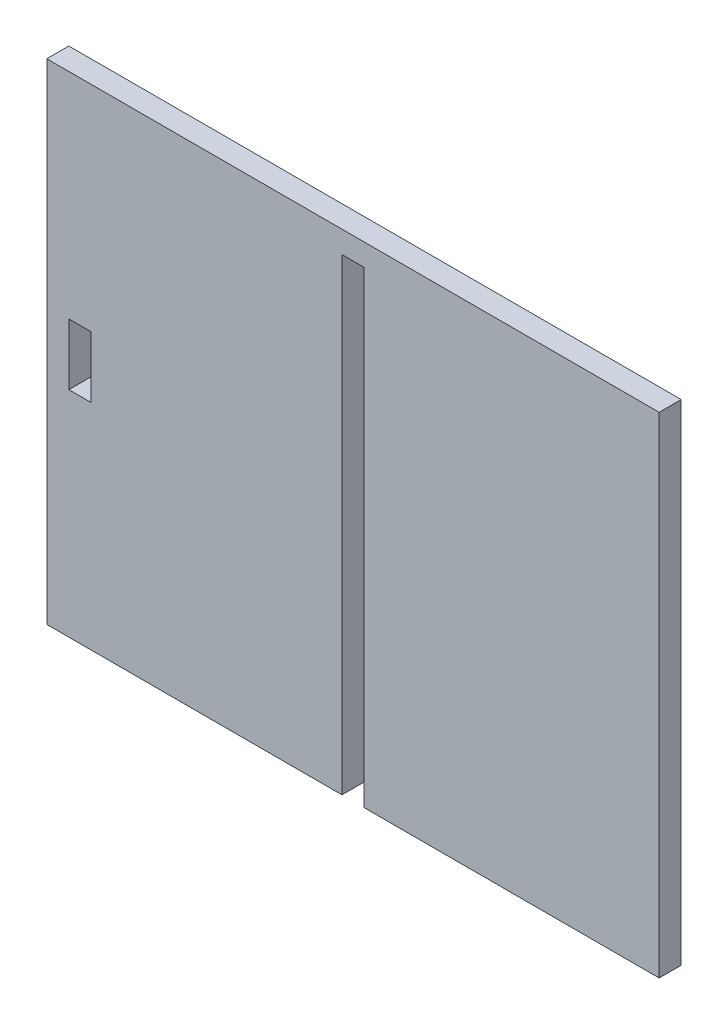
ISO-10303-21;
HEADER;
FILE_DESCRIPTION(('STEP AP214'),'2;1');
FILE_NAME('part.step','',(''),(''),'','','');
FILE_SCHEMA(('AUTOMOTIVE_DESIGN { 1 0 10303 214 1 1 1 1 }'));
ENDSEC;
DATA;
#1=APPLICATION_CONTEXT('core data for automotive mechanical design processes');
#2=APPLICATION_PROTOCOL_DEFINITION('international standard','automotive_design',2000,#1);
#3=PRODUCT_CONTEXT('',#1,'mechanical');
#4=PRODUCT('Part','Part','',(#3));
#5=PRODUCT_RELATED_PRODUCT_CATEGORY('part','',(#4));
#6=PRODUCT_DEFINITION_FORMATION('','',#4);
#7=PRODUCT_DEFINITION_CONTEXT('part definition',#1,'design');
#8=PRODUCT_DEFINITION('design','',#6,#7);
#9=PRODUCT_DEFINITION_SHAPE('','',#8);
#10=(LENGTH_UNIT() NAMED_UNIT(*) SI_UNIT(.MILLI.,.METRE.));
#11=(NAMED_UNIT(*) PLANE_ANGLE_UNIT() SI_UNIT($,.RADIAN.));
#12=(NAMED_UNIT(*) SI_UNIT($,.STERADIAN.) SOLID_ANGLE_UNIT());
#13=UNCERTAINTY_MEASURE_WITH_UNIT(LENGTH_MEASURE(1.E-05),#10,'distance_accuracy_value','');
#14=(GEOMETRIC_REPRESENTATION_CONTEXT(3) GLOBAL_UNCERTAINTY_ASSIGNED_CONTEXT((#13)) GLOBAL_UNIT_ASSIGNED_CONTEXT((#10,
#11,#12)) REPRESENTATION_CONTEXT('',''));
#15=CARTESIAN_POINT('',(0.,0.,0.));
#16=DIRECTION('',(0.,0.,1.));
#17=DIRECTION('',(1.,0.,0.));
#18=AXIS2_PLACEMENT_3D('',#15,#16,#17);
#19=CARTESIAN_POINT('',(0.,0.,18.));
#20=DIRECTION('',(0.,0.,1.));
#21=DIRECTION('',(1.,0.,0.));
#22=AXIS2_PLACEMENT_3D('',#19,#20,#21);
#23=PLANE('',#22);
#24=DIRECTION('',(0.,1.,0.));
#25=VECTOR('',#24,1.);
#26=CARTESIAN_POINT('',(243.231655058217,200.,18.));
#27=LINE('',#26,#25);
#28=CARTESIAN_POINT('',(243.231655058217,-200.,18.));
#29=VERTEX_POINT('',#28);
#30=CARTESIAN_POINT('',(243.231655058217,200.,18.));
#31=VERTEX_POINT('',#30);
#32=EDGE_CURVE('E158',#29,#31,#27,.T.);
#33=ORIENTED_EDGE('',*,*,#32,.T.);
#34=DIRECTION('',(-1.,0.,0.));
#35=VECTOR('',#34,1.);
#36=CARTESIAN_POINT('',(-256.768344941783,200.,18.));
#37=LINE('',#36,#35);
#38=CARTESIAN_POINT('',(-256.768344941783,200.,18.));
#39=VERTEX_POINT('',#38);
#40=EDGE_CURVE('E161',#31,#39,#37,.T.);
#41=ORIENTED_EDGE('',*,*,#40,.T.);
#42=DIRECTION('',(0.,-1.,0.));
#43=VECTOR('',#42,1.);
#44=CARTESIAN_POINT('',(-256.768344941783,200.,18.));
#45=LINE('',#44,#43);
#46=CARTESIAN_POINT('',(-256.768344941783,-200.,18.));
#47=VERTEX_POINT('',#46);
#48=EDGE_CURVE('E164',#39,#47,#45,.T.);
#49=ORIENTED_EDGE('',*,*,#48,.T.);
#50=DIRECTION('',(1.,0.,0.));
#51=VECTOR('',#50,1.);
#52=CARTESIAN_POINT('',(-256.768344941783,-200.,18.));
#53=LINE('',#52,#51);
#54=CARTESIAN_POINT('',(-15.7683449417825,-200.,18.));
#55=VERTEX_POINT('',#54);
#56=EDGE_CURVE('E166',#47,#55,#53,.T.);
#57=ORIENTED_EDGE('',*,*,#56,.T.);
#58=DIRECTION('',(0.,1.,0.));
#59=VECTOR('',#58,1.);
#60=CARTESIAN_POINT('',(-15.7683449417826,182.,18.));
#61=LINE('',#60,#59);
#62=CARTESIAN_POINT('',(-15.7683449417826,182.,18.));
#63=VERTEX_POINT('',#62);
#64=EDGE_CURVE('E168',#55,#63,#61,.T.);
#65=ORIENTED_EDGE('',*,*,#64,.T.);
#66=DIRECTION('',(1.,0.,0.));
#67=VECTOR('',#66,1.);
#68=CARTESIAN_POINT('',(-15.7683449417826,182.,18.));
#69=LINE('',#68,#67);
#70=CARTESIAN_POINT('',(2.23165505821744,182.,18.));
#71=VERTEX_POINT('',#70);
#72=EDGE_CURVE('E170',#63,#71,#69,.T.);
#73=ORIENTED_EDGE('',*,*,#72,.T.);
#74=DIRECTION('',(0.,-1.,0.));
#75=VECTOR('',#74,1.);
#76=CARTESIAN_POINT('',(2.23165505821744,182.,18.));
#77=LINE('',#76,#75);
#78=CARTESIAN_POINT('',(2.23165505821749,-200.,18.));
#79=VERTEX_POINT('',#78);
#80=EDGE_CURVE('E172',#71,#79,#77,.T.);
#81=ORIENTED_EDGE('',*,*,#80,.T.);
#82=DIRECTION('',(1.,0.,0.));
#83=VECTOR('',#82,1.);
#84=CARTESIAN_POINT('',(2.23165505821749,-200.,18.));
#85=LINE('',#84,#83);
#86=EDGE_CURVE('E174',#79,#29,#85,.T.);
#87=ORIENTED_EDGE('',*,*,#86,.T.);
#88=EDGE_LOOP('',(#33,#41,#49,#57,#65,#73,#81,#87));
#89=FACE_BOUND('',#88,.T.);
#90=DIRECTION('',(-1.,0.,0.));
#91=VECTOR('',#90,1.);
#92=CARTESIAN_POINT('',(-238.768344941783,24.9999999999999,18.));
#93=LINE('',#92,#91);
#94=CARTESIAN_POINT('',(-220.768344941783,24.9999999999999,18.));
#95=VERTEX_POINT('',#94);
#96=CARTESIAN_POINT('',(-238.768344941783,24.9999999999999,18.));
#97=VERTEX_POINT('',#96);
#98=EDGE_CURVE('E130',#95,#97,#93,.T.);
#99=ORIENTED_EDGE('',*,*,#98,.F.);
#100=DIRECTION('',(0.,1.,0.));
#101=VECTOR('',#100,1.);
#102=CARTESIAN_POINT('',(-220.768344941783,24.9999999999999,18.));
#103=LINE('',#102,#101);
#104=CARTESIAN_POINT('',(-220.768344941782,-25.0000000000001,18.));
#105=VERTEX_POINT('',#104);
#106=EDGE_CURVE('E122',#105,#95,#103,.T.);
#107=ORIENTED_EDGE('',*,*,#106,.F.);
#108=DIRECTION('',(1.,0.,0.));
#109=VECTOR('',#108,1.);
#110=CARTESIAN_POINT('',(-238.768344941782,-25.0000000000001,18.));
#111=LINE('',#110,#109);
#112=CARTESIAN_POINT('',(-238.768344941782,-25.0000000000001,18.));
#113=VERTEX_POINT('',#112);
#114=EDGE_CURVE('E144',#113,#105,#111,.T.);
#115=ORIENTED_EDGE('',*,*,#114,.F.);
#116=DIRECTION('',(0.,-1.,0.));
#117=VECTOR('',#116,1.);
#118=CARTESIAN_POINT('',(-238.768344941783,24.9999999999999,18.));
#119=LINE('',#118,#117);
#120=EDGE_CURVE('E142',#97,#113,#119,.T.);
#121=ORIENTED_EDGE('',*,*,#120,.F.);
#122=EDGE_LOOP('',(#99,#107,#115,#121));
#123=FACE_BOUND('',#122,.T.);
#124=ADVANCED_FACE('F33',(#89,#123),#23,.T.);
#125=CARTESIAN_POINT('',(0.,0.,0.));
#126=DIRECTION('',(0.,0.,1.));
#127=DIRECTION('',(1.,0.,0.));
#128=AXIS2_PLACEMENT_3D('',#125,#126,#127);
#129=PLANE('',#128);
#130=DIRECTION('',(0.,1.,0.));
#131=VECTOR('',#130,1.);
#132=CARTESIAN_POINT('',(243.231655058217,200.,0.));
#133=LINE('',#132,#131);
#134=CARTESIAN_POINT('',(243.231655058217,-200.,0.));
#135=VERTEX_POINT('',#134);
#136=CARTESIAN_POINT('',(243.231655058217,200.,0.));
#137=VERTEX_POINT('',#136);
#138=EDGE_CURVE('E138',#135,#137,#133,.T.);
#139=ORIENTED_EDGE('',*,*,#138,.F.);
#140=DIRECTION('',(1.,0.,0.));
#141=VECTOR('',#140,1.);
#142=CARTESIAN_POINT('',(2.23165505821749,-200.,0.));
#143=LINE('',#142,#141);
#144=CARTESIAN_POINT('',(2.23165505821749,-200.,0.));
#145=VERTEX_POINT('',#144);
#146=EDGE_CURVE('E162',#145,#135,#143,.T.);
#147=ORIENTED_EDGE('',*,*,#146,.F.);
#148=DIRECTION('',(0.,-1.,0.));
#149=VECTOR('',#148,1.);
#150=CARTESIAN_POINT('',(2.23165505821744,182.,0.));
#151=LINE('',#150,#149);
#152=CARTESIAN_POINT('',(2.23165505821744,182.,0.));
#153=VERTEX_POINT('',#152);
#154=EDGE_CURVE('E189',#153,#145,#151,.T.);
#155=ORIENTED_EDGE('',*,*,#154,.F.);
#156=DIRECTION('',(1.,0.,0.));
#157=VECTOR('',#156,1.);
#158=CARTESIAN_POINT('',(-15.7683449417826,182.,0.));
#159=LINE('',#158,#157);
#160=CARTESIAN_POINT('',(-15.7683449417826,182.,0.));
#161=VERTEX_POINT('',#160);
#162=EDGE_CURVE('E187',#161,#153,#159,.T.);
#163=ORIENTED_EDGE('',*,*,#162,.F.);
#164=DIRECTION('',(0.,1.,0.));
#165=VECTOR('',#164,1.);
#166=CARTESIAN_POINT('',(-15.7683449417826,182.,0.));
#167=LINE('',#166,#165);
#168=CARTESIAN_POINT('',(-15.7683449417825,-200.,0.));
#169=VERTEX_POINT('',#168);
#170=EDGE_CURVE('E185',#169,#161,#167,.T.);
#171=ORIENTED_EDGE('',*,*,#170,.F.);
#172=DIRECTION('',(1.,0.,0.));
#173=VECTOR('',#172,1.);
#174=CARTESIAN_POINT('',(-256.768344941783,-200.,0.));
#175=LINE('',#174,#173);
#176=CARTESIAN_POINT('',(-256.768344941783,-200.,0.));
#177=VERTEX_POINT('',#176);
#178=EDGE_CURVE('E183',#177,#169,#175,.T.);
#179=ORIENTED_EDGE('',*,*,#178,.F.);
#180=DIRECTION('',(0.,-1.,0.));
#181=VECTOR('',#180,1.);
#182=CARTESIAN_POINT('',(-256.768344941783,200.,0.));
#183=LINE('',#182,#181);
#184=CARTESIAN_POINT('',(-256.768344941783,200.,0.));
#185=VERTEX_POINT('',#184);
#186=EDGE_CURVE('E181',#185,#177,#183,.T.);
#187=ORIENTED_EDGE('',*,*,#186,.F.);
#188=DIRECTION('',(-1.,0.,0.));
#189=VECTOR('',#188,1.);
#190=CARTESIAN_POINT('',(-256.768344941783,200.,0.));
#191=LINE('',#190,#189);
#192=EDGE_CURVE('E179',#137,#185,#191,.T.);
#193=ORIENTED_EDGE('',*,*,#192,.F.);
#194=EDGE_LOOP('',(#139,#147,#155,#163,#171,#179,#187,#193));
#195=FACE_BOUND('',#194,.T.);
#196=DIRECTION('',(0.,1.,0.));
#197=VECTOR('',#196,1.);
#198=CARTESIAN_POINT('',(-220.768344941783,24.9999999999999,0.));
#199=LINE('',#198,#197);
#200=CARTESIAN_POINT('',(-220.768344941782,-25.0000000000001,0.));
#201=VERTEX_POINT('',#200);
#202=CARTESIAN_POINT('',(-220.768344941783,24.9999999999999,0.));
#203=VERTEX_POINT('',#202);
#204=EDGE_CURVE('E56',#201,#203,#199,.T.);
#205=ORIENTED_EDGE('',*,*,#204,.T.);
#206=DIRECTION('',(-1.,0.,0.));
#207=VECTOR('',#206,1.);
#208=CARTESIAN_POINT('',(-238.768344941783,24.9999999999999,0.));
#209=LINE('',#208,#207);
#210=CARTESIAN_POINT('',(-238.768344941783,24.9999999999999,0.));
#211=VERTEX_POINT('',#210);
#212=EDGE_CURVE('E137',#203,#211,#209,.T.);
#213=ORIENTED_EDGE('',*,*,#212,.T.);
#214=DIRECTION('',(0.,-1.,0.));
#215=VECTOR('',#214,1.);
#216=CARTESIAN_POINT('',(-238.768344941783,24.9999999999999,0.));
#217=LINE('',#216,#215);
#218=CARTESIAN_POINT('',(-238.768344941782,-25.0000000000001,0.));
#219=VERTEX_POINT('',#218);
#220=EDGE_CURVE('E150',#211,#219,#217,.T.);
#221=ORIENTED_EDGE('',*,*,#220,.T.);
#222=DIRECTION('',(1.,0.,0.));
#223=VECTOR('',#222,1.);
#224=CARTESIAN_POINT('',(-238.768344941782,-25.0000000000001,0.));
#225=LINE('',#224,#223);
#226=EDGE_CURVE('E131',#219,#201,#225,.T.);
#227=ORIENTED_EDGE('',*,*,#226,.T.);
#228=EDGE_LOOP('',(#205,#213,#221,#227));
#229=FACE_BOUND('',#228,.T.);
#230=ADVANCED_FACE('F219',(#195,#229),#129,.F.);
#231=CARTESIAN_POINT('',(243.231655058217,200.,18.));
#232=DIRECTION('',(-1.,0.,0.));
#233=DIRECTION('',(0.,-1.,0.));
#234=AXIS2_PLACEMENT_3D('',#231,#232,#233);
#235=PLANE('',#234);
#236=ORIENTED_EDGE('',*,*,#138,.T.);
#237=DIRECTION('',(0.,0.,-1.));
#238=VECTOR('',#237,1.);
#239=CARTESIAN_POINT('',(243.231655058217,200.,18.));
#240=LINE('',#239,#238);
#241=EDGE_CURVE('E11',#31,#137,#240,.T.);
#242=ORIENTED_EDGE('',*,*,#241,.F.);
#243=ORIENTED_EDGE('',*,*,#32,.F.);
#244=DIRECTION('',(0.,0.,-1.));
#245=VECTOR('',#244,1.);
#246=CARTESIAN_POINT('',(243.231655058217,-200.,18.));
#247=LINE('',#246,#245);
#248=EDGE_CURVE('E176',#29,#135,#247,.T.);
#249=ORIENTED_EDGE('',*,*,#248,.T.);
#250=EDGE_LOOP('',(#236,#242,#243,#249));
#251=FACE_BOUND('',#250,.T.);
#252=ADVANCED_FACE('F35',(#251),#235,.F.);
#253=CARTESIAN_POINT('',(-256.768344941783,200.,18.));
#254=DIRECTION('',(0.,-1.,0.));
#255=DIRECTION('',(0.,0.,-1.));
#256=AXIS2_PLACEMENT_3D('',#253,#254,#255);
#257=PLANE('',#256);
#258=ORIENTED_EDGE('',*,*,#192,.T.);
#259=DIRECTION('',(0.,0.,-1.));
#260=VECTOR('',#259,1.);
#261=CARTESIAN_POINT('',(-256.768344941783,200.,18.));
#262=LINE('',#261,#260);
#263=EDGE_CURVE('E41',#39,#185,#262,.T.);
#264=ORIENTED_EDGE('',*,*,#263,.F.);
#265=ORIENTED_EDGE('',*,*,#40,.F.);
#266=ORIENTED_EDGE('',*,*,#241,.T.);
#267=EDGE_LOOP('',(#258,#264,#265,#266));
#268=FACE_BOUND('',#267,.T.);
#269=ADVANCED_FACE('F236',(#268),#257,.F.);
#270=CARTESIAN_POINT('',(-256.768344941783,200.,18.));
#271=DIRECTION('',(1.,0.,0.));
#272=DIRECTION('',(0.,1.,0.));
#273=AXIS2_PLACEMENT_3D('',#270,#271,#272);
#274=PLANE('',#273);
#275=ORIENTED_EDGE('',*,*,#186,.T.);
#276=DIRECTION('',(0.,0.,-1.));
#277=VECTOR('',#276,1.);
#278=CARTESIAN_POINT('',(-256.768344941783,-200.,18.));
#279=LINE('',#278,#277);
#280=EDGE_CURVE('E206',#47,#177,#279,.T.);
#281=ORIENTED_EDGE('',*,*,#280,.F.);
#282=ORIENTED_EDGE('',*,*,#48,.F.);
#283=ORIENTED_EDGE('',*,*,#263,.T.);
#284=EDGE_LOOP('',(#275,#281,#282,#283));
#285=FACE_BOUND('',#284,.T.);
#286=ADVANCED_FACE('F213',(#285),#274,.F.);
#287=CARTESIAN_POINT('',(-256.768344941783,-200.,18.));
#288=DIRECTION('',(0.,1.,0.));
#289=DIRECTION('',(0.,0.,1.));
#290=AXIS2_PLACEMENT_3D('',#287,#288,#289);
#291=PLANE('',#290);
#292=ORIENTED_EDGE('',*,*,#178,.T.);
#293=DIRECTION('',(0.,0.,-1.));
#294=VECTOR('',#293,1.);
#295=CARTESIAN_POINT('',(-15.7683449417825,-200.,18.));
#296=LINE('',#295,#294);
#297=EDGE_CURVE('E203',#55,#169,#296,.T.);
#298=ORIENTED_EDGE('',*,*,#297,.F.);
#299=ORIENTED_EDGE('',*,*,#56,.F.);
#300=ORIENTED_EDGE('',*,*,#280,.T.);
#301=EDGE_LOOP('',(#292,#298,#299,#300));
#302=FACE_BOUND('',#301,.T.);
#303=ADVANCED_FACE('F225',(#302),#291,.F.);
#304=CARTESIAN_POINT('',(-15.7683449417826,182.,18.));
#305=DIRECTION('',(-1.,0.,0.));
#306=DIRECTION('',(0.,-1.,0.));
#307=AXIS2_PLACEMENT_3D('',#304,#305,#306);
#308=PLANE('',#307);
#309=ORIENTED_EDGE('',*,*,#170,.T.);
#310=DIRECTION('',(0.,0.,-1.));
#311=VECTOR('',#310,1.);
#312=CARTESIAN_POINT('',(-15.7683449417826,182.,18.));
#313=LINE('',#312,#311);
#314=EDGE_CURVE('E200',#63,#161,#313,.T.);
#315=ORIENTED_EDGE('',*,*,#314,.F.);
#316=ORIENTED_EDGE('',*,*,#64,.F.);
#317=ORIENTED_EDGE('',*,*,#297,.T.);
#318=EDGE_LOOP('',(#309,#315,#316,#317));
#319=FACE_BOUND('',#318,.T.);
#320=ADVANCED_FACE('F229',(#319),#308,.F.);
#321=CARTESIAN_POINT('',(-15.7683449417826,182.,18.));
#322=DIRECTION('',(0.,1.,0.));
#323=DIRECTION('',(-1.,0.,0.));
#324=AXIS2_PLACEMENT_3D('',#321,#322,#323);
#325=PLANE('',#324);
#326=ORIENTED_EDGE('',*,*,#162,.T.);
#327=DIRECTION('',(0.,0.,-1.));
#328=VECTOR('',#327,1.);
#329=CARTESIAN_POINT('',(2.23165505821744,182.,18.));
#330=LINE('',#329,#328);
#331=EDGE_CURVE('E197',#71,#153,#330,.T.);
#332=ORIENTED_EDGE('',*,*,#331,.F.);
#333=ORIENTED_EDGE('',*,*,#72,.F.);
#334=ORIENTED_EDGE('',*,*,#314,.T.);
#335=EDGE_LOOP('',(#326,#332,#333,#334));
#336=FACE_BOUND('',#335,.T.);
#337=ADVANCED_FACE('F249',(#336),#325,.F.);
#338=CARTESIAN_POINT('',(2.23165505821744,182.,18.));
#339=DIRECTION('',(1.,0.,0.));
#340=DIRECTION('',(0.,1.,0.));
#341=AXIS2_PLACEMENT_3D('',#338,#339,#340);
#342=PLANE('',#341);
#343=ORIENTED_EDGE('',*,*,#154,.T.);
#344=DIRECTION('',(0.,0.,-1.));
#345=VECTOR('',#344,1.);
#346=CARTESIAN_POINT('',(2.23165505821749,-200.,18.));
#347=LINE('',#346,#345);
#348=EDGE_CURVE('E194',#79,#145,#347,.T.);
#349=ORIENTED_EDGE('',*,*,#348,.F.);
#350=ORIENTED_EDGE('',*,*,#80,.F.);
#351=ORIENTED_EDGE('',*,*,#331,.T.);
#352=EDGE_LOOP('',(#343,#349,#350,#351));
#353=FACE_BOUND('',#352,.T.);
#354=ADVANCED_FACE('F247',(#353),#342,.F.);
#355=CARTESIAN_POINT('',(2.23165505821749,-200.,18.));
#356=DIRECTION('',(0.,1.,0.));
#357=DIRECTION('',(-1.,0.,0.));
#358=AXIS2_PLACEMENT_3D('',#355,#356,#357);
#359=PLANE('',#358);
#360=ORIENTED_EDGE('',*,*,#146,.T.);
#361=ORIENTED_EDGE('',*,*,#248,.F.);
#362=ORIENTED_EDGE('',*,*,#86,.F.);
#363=ORIENTED_EDGE('',*,*,#348,.T.);
#364=EDGE_LOOP('',(#360,#361,#362,#363));
#365=FACE_BOUND('',#364,.T.);
#366=ADVANCED_FACE('F242',(#365),#359,.F.);
#367=CARTESIAN_POINT('',(-220.768344941783,24.9999999999999,18.));
#368=DIRECTION('',(-1.,0.,0.));
#369=DIRECTION('',(0.,-1.,0.));
#370=AXIS2_PLACEMENT_3D('',#367,#368,#369);
#371=PLANE('',#370);
#372=ORIENTED_EDGE('',*,*,#204,.F.);
#373=DIRECTION('',(0.,0.,-1.));
#374=VECTOR('',#373,1.);
#375=CARTESIAN_POINT('',(-220.768344941782,-25.0000000000001,18.));
#376=LINE('',#375,#374);
#377=EDGE_CURVE('E126',#105,#201,#376,.T.);
#378=ORIENTED_EDGE('',*,*,#377,.F.);
#379=ORIENTED_EDGE('',*,*,#106,.T.);
#380=DIRECTION('',(0.,0.,-1.));
#381=VECTOR('',#380,1.);
#382=CARTESIAN_POINT('',(-220.768344941783,24.9999999999999,18.));
#383=LINE('',#382,#381);
#384=EDGE_CURVE('E125',#95,#203,#383,.T.);
#385=ORIENTED_EDGE('',*,*,#384,.T.);
#386=EDGE_LOOP('',(#372,#378,#379,#385));
#387=FACE_BOUND('',#386,.T.);
#388=ADVANCED_FACE('F124',(#387),#371,.T.);
#389=CARTESIAN_POINT('',(-238.768344941783,24.9999999999999,18.));
#390=DIRECTION('',(0.,-1.,0.));
#391=DIRECTION('',(0.,0.,-1.));
#392=AXIS2_PLACEMENT_3D('',#389,#390,#391);
#393=PLANE('',#392);
#394=ORIENTED_EDGE('',*,*,#212,.F.);
#395=ORIENTED_EDGE('',*,*,#384,.F.);
#396=ORIENTED_EDGE('',*,*,#98,.T.);
#397=DIRECTION('',(0.,0.,-1.));
#398=VECTOR('',#397,1.);
#399=CARTESIAN_POINT('',(-238.768344941783,24.9999999999999,18.));
#400=LINE('',#399,#398);
#401=EDGE_CURVE('E139',#97,#211,#400,.T.);
#402=ORIENTED_EDGE('',*,*,#401,.T.);
#403=EDGE_LOOP('',(#394,#395,#396,#402));
#404=FACE_BOUND('',#403,.T.);
#405=ADVANCED_FACE('F134',(#404),#393,.T.);
#406=CARTESIAN_POINT('',(-238.768344941783,24.9999999999999,18.));
#407=DIRECTION('',(1.,0.,0.));
#408=DIRECTION('',(0.,1.,0.));
#409=AXIS2_PLACEMENT_3D('',#406,#407,#408);
#410=PLANE('',#409);
#411=ORIENTED_EDGE('',*,*,#220,.F.);
#412=ORIENTED_EDGE('',*,*,#401,.F.);
#413=ORIENTED_EDGE('',*,*,#120,.T.);
#414=DIRECTION('',(0.,0.,-1.));
#415=VECTOR('',#414,1.);
#416=CARTESIAN_POINT('',(-238.768344941782,-25.0000000000001,18.));
#417=LINE('',#416,#415);
#418=EDGE_CURVE('E48',#113,#219,#417,.T.);
#419=ORIENTED_EDGE('',*,*,#418,.T.);
#420=EDGE_LOOP('',(#411,#412,#413,#419));
#421=FACE_BOUND('',#420,.T.);
#422=ADVANCED_FACE('F274',(#421),#410,.T.);
#423=CARTESIAN_POINT('',(-238.768344941782,-25.0000000000001,18.));
#424=DIRECTION('',(0.,1.,0.));
#425=DIRECTION('',(0.,0.,1.));
#426=AXIS2_PLACEMENT_3D('',#423,#424,#425);
#427=PLANE('',#426);
#428=ORIENTED_EDGE('',*,*,#226,.F.);
#429=ORIENTED_EDGE('',*,*,#418,.F.);
#430=ORIENTED_EDGE('',*,*,#114,.T.);
#431=ORIENTED_EDGE('',*,*,#377,.T.);
#432=EDGE_LOOP('',(#428,#429,#430,#431));
#433=FACE_BOUND('',#432,.T.);
#434=ADVANCED_FACE('F278',(#433),#427,.T.);
#435=CLOSED_SHELL('',(#124,#230,#252,#269,#286,#303,#320,#337,#354,#366,#388,#405,#422,#434));
#436=MANIFOLD_SOLID_BREP('B2',#435);
#437=ADVANCED_BREP_SHAPE_REPRESENTATION('',(#18,#436),#14);
#438=SHAPE_DEFINITION_REPRESENTATION(#9,#437);
ENDSEC;
END-ISO-10303-21;
